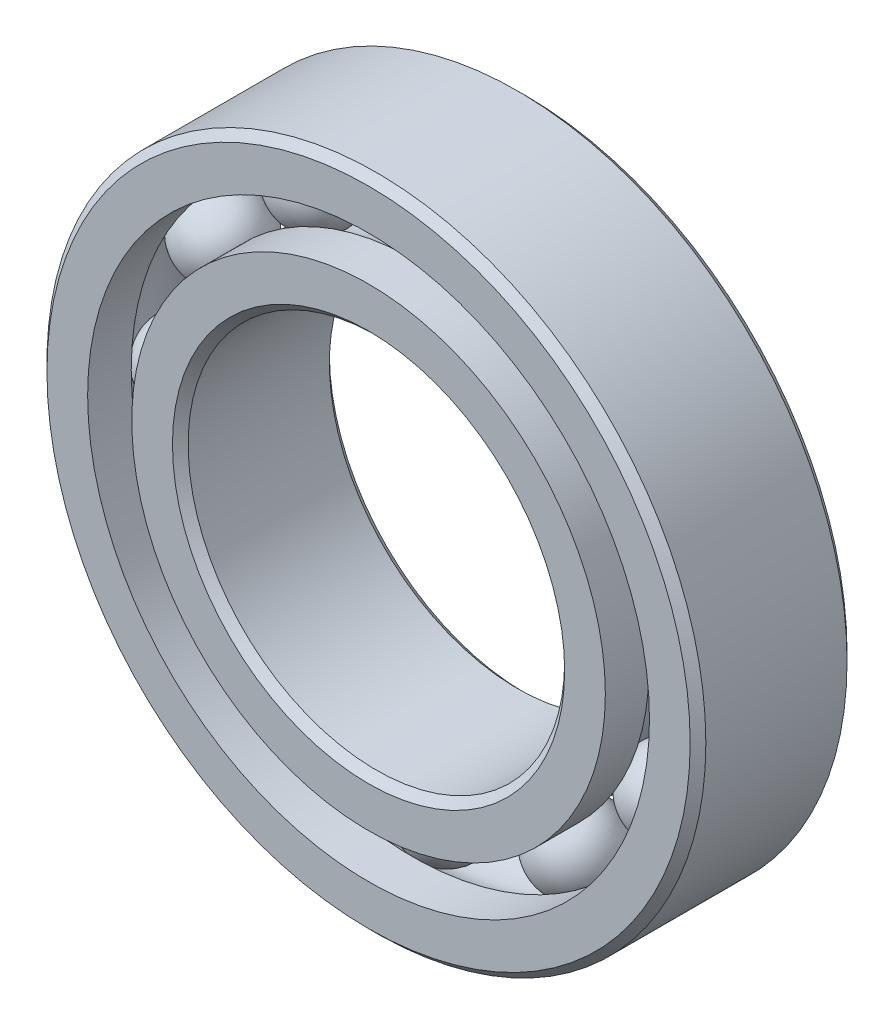
ISO-10303-21;
HEADER;
FILE_DESCRIPTION(('STEP AP214'),'2;1');
FILE_NAME('part.step','',(''),(''),'','','');
FILE_SCHEMA(('AUTOMOTIVE_DESIGN { 1 0 10303 214 1 1 1 1 }'));
ENDSEC;
DATA;
#1=APPLICATION_CONTEXT('core data for automotive mechanical design processes');
#2=APPLICATION_PROTOCOL_DEFINITION('international standard','automotive_design',2000,#1);
#3=PRODUCT_CONTEXT('',#1,'mechanical');
#4=PRODUCT('Part','Part','',(#3));
#5=PRODUCT_RELATED_PRODUCT_CATEGORY('part','',(#4));
#6=PRODUCT_DEFINITION_FORMATION('','',#4);
#7=PRODUCT_DEFINITION_CONTEXT('part definition',#1,'design');
#8=PRODUCT_DEFINITION('design','',#6,#7);
#9=PRODUCT_DEFINITION_SHAPE('','',#8);
#10=(LENGTH_UNIT() NAMED_UNIT(*) SI_UNIT(.MILLI.,.METRE.));
#11=(NAMED_UNIT(*) PLANE_ANGLE_UNIT() SI_UNIT($,.RADIAN.));
#12=(NAMED_UNIT(*) SI_UNIT($,.STERADIAN.) SOLID_ANGLE_UNIT());
#13=UNCERTAINTY_MEASURE_WITH_UNIT(LENGTH_MEASURE(1.E-05),#10,'distance_accuracy_value','');
#14=(GEOMETRIC_REPRESENTATION_CONTEXT(3) GLOBAL_UNCERTAINTY_ASSIGNED_CONTEXT((#13)) GLOBAL_UNIT_ASSIGNED_CONTEXT((#10,
#11,#12)) REPRESENTATION_CONTEXT('',''));
#15=CARTESIAN_POINT('',(0.,0.,0.));
#16=DIRECTION('',(0.,0.,1.));
#17=DIRECTION('',(1.,0.,0.));
#18=AXIS2_PLACEMENT_3D('',#15,#16,#17);
#19=CARTESIAN_POINT('',(-4.12499999999991,7.14470958122167,0.));
#20=DIRECTION('',(0.,0.,1.));
#21=DIRECTION('',(-0.499999999999989,0.866025403784445,0.));
#22=AXIS2_PLACEMENT_3D('',#19,#20,#21);
#23=SPHERICAL_SURFACE('',#22,1.31498827146959);
#24=CARTESIAN_POINT('',(-4.12499999999991,7.14470958122167,1.31498827146959));
#25=VERTEX_POINT('',#24);
#26=VERTEX_LOOP('',#25);
#27=FACE_BOUND('',#26,.T.);
#28=ADVANCED_FACE('F40',(#27),#23,.T.);
#29=CLOSED_SHELL('',(#28));
#30=MANIFOLD_SOLID_BREP('B2',#29);
#31=CARTESIAN_POINT('',(-7.14470958122157,4.12500000000008,0.));
#32=DIRECTION('',(0.,0.,1.));
#33=DIRECTION('',(-0.866025403784433,0.50000000000001,0.));
#34=AXIS2_PLACEMENT_3D('',#31,#32,#33);
#35=SPHERICAL_SURFACE('',#34,1.31498827146959);
#36=CARTESIAN_POINT('',(-7.14470958122157,4.12500000000008,1.31498827146959));
#37=VERTEX_POINT('',#36);
#38=VERTEX_LOOP('',#37);
#39=FACE_BOUND('',#38,.T.);
#40=ADVANCED_FACE('F61',(#39),#35,.T.);
#41=CLOSED_SHELL('',(#40));
#42=MANIFOLD_SOLID_BREP('B6',#41);
#43=CARTESIAN_POINT('',(-8.25,0.,0.));
#44=DIRECTION('',(0.,0.,1.));
#45=DIRECTION('',(-1.,0.,0.));
#46=AXIS2_PLACEMENT_3D('',#43,#44,#45);
#47=SPHERICAL_SURFACE('',#46,1.31498827146959);
#48=CARTESIAN_POINT('',(-8.25,0.,1.31498827146959));
#49=VERTEX_POINT('',#48);
#50=VERTEX_LOOP('',#49);
#51=FACE_BOUND('',#50,.T.);
#52=ADVANCED_FACE('F82',(#51),#47,.T.);
#53=CLOSED_SHELL('',(#52));
#54=MANIFOLD_SOLID_BREP('B36',#53);
#55=CARTESIAN_POINT('',(-7.14470958122166,-4.12499999999993,0.));
#56=DIRECTION('',(0.,0.,1.));
#57=DIRECTION('',(-0.866025403784443,-0.499999999999992,0.));
#58=AXIS2_PLACEMENT_3D('',#55,#56,#57);
#59=SPHERICAL_SURFACE('',#58,1.31498827146959);
#60=CARTESIAN_POINT('',(-7.14470958122166,-4.12499999999993,1.31498827146959));
#61=VERTEX_POINT('',#60);
#62=VERTEX_LOOP('',#61);
#63=FACE_BOUND('',#62,.T.);
#64=ADVANCED_FACE('F103',(#63),#59,.T.);
#65=CLOSED_SHELL('',(#64));
#66=MANIFOLD_SOLID_BREP('B57',#65);
#67=CARTESIAN_POINT('',(-4.12500000000006,-7.14470958122159,0.));
#68=DIRECTION('',(0.,0.,1.));
#69=DIRECTION('',(-0.500000000000007,-0.866025403784435,0.));
#70=AXIS2_PLACEMENT_3D('',#67,#68,#69);
#71=SPHERICAL_SURFACE('',#70,1.31498827146959);
#72=CARTESIAN_POINT('',(-4.12500000000006,-7.14470958122159,1.31498827146959));
#73=VERTEX_POINT('',#72);
#74=VERTEX_LOOP('',#73);
#75=FACE_BOUND('',#74,.T.);
#76=ADVANCED_FACE('F124',(#75),#71,.T.);
#77=CLOSED_SHELL('',(#76));
#78=MANIFOLD_SOLID_BREP('B78',#77);
#79=CARTESIAN_POINT('',(0.,-8.25,0.));
#80=DIRECTION('',(0.,0.,1.));
#81=DIRECTION('',(0.,-1.,0.));
#82=AXIS2_PLACEMENT_3D('',#79,#80,#81);
#83=SPHERICAL_SURFACE('',#82,1.31498827146959);
#84=CARTESIAN_POINT('',(0.,-8.25,1.31498827146959));
#85=VERTEX_POINT('',#84);
#86=VERTEX_LOOP('',#85);
#87=FACE_BOUND('',#86,.T.);
#88=ADVANCED_FACE('F145',(#87),#83,.T.);
#89=CLOSED_SHELL('',(#88));
#90=MANIFOLD_SOLID_BREP('B99',#89);
#91=CARTESIAN_POINT('',(4.12499999999996,-7.14470958122164,0.));
#92=DIRECTION('',(0.,0.,1.));
#93=DIRECTION('',(0.499999999999995,-0.866025403784442,0.));
#94=AXIS2_PLACEMENT_3D('',#91,#92,#93);
#95=SPHERICAL_SURFACE('',#94,1.31498827146959);
#96=CARTESIAN_POINT('',(4.12499999999996,-7.14470958122164,1.31498827146959));
#97=VERTEX_POINT('',#96);
#98=VERTEX_LOOP('',#97);
#99=FACE_BOUND('',#98,.T.);
#100=ADVANCED_FACE('F166',(#99),#95,.T.);
#101=CLOSED_SHELL('',(#100));
#102=MANIFOLD_SOLID_BREP('B120',#101);
#103=CARTESIAN_POINT('',(7.1447095812216,-4.12500000000003,0.));
#104=DIRECTION('',(0.,0.,1.));
#105=DIRECTION('',(0.866025403784436,-0.500000000000004,0.));
#106=AXIS2_PLACEMENT_3D('',#103,#104,#105);
#107=SPHERICAL_SURFACE('',#106,1.31498827146959);
#108=CARTESIAN_POINT('',(7.1447095812216,-4.12500000000003,1.31498827146959));
#109=VERTEX_POINT('',#108);
#110=VERTEX_LOOP('',#109);
#111=FACE_BOUND('',#110,.T.);
#112=ADVANCED_FACE('F187',(#111),#107,.T.);
#113=CLOSED_SHELL('',(#112));
#114=MANIFOLD_SOLID_BREP('B141',#113);
#115=CARTESIAN_POINT('',(8.25,0.,0.));
#116=DIRECTION('',(0.,0.,1.));
#117=DIRECTION('',(1.,0.,0.));
#118=AXIS2_PLACEMENT_3D('',#115,#116,#117);
#119=SPHERICAL_SURFACE('',#118,1.31498827146959);
#120=CARTESIAN_POINT('',(8.25,0.,1.31498827146959));
#121=VERTEX_POINT('',#120);
#122=VERTEX_LOOP('',#121);
#123=FACE_BOUND('',#122,.T.);
#124=ADVANCED_FACE('F208',(#123),#119,.T.);
#125=CLOSED_SHELL('',(#124));
#126=MANIFOLD_SOLID_BREP('B162',#125);
#127=CARTESIAN_POINT('',(7.14470958122163,4.12499999999998,0.));
#128=DIRECTION('',(0.,0.,1.));
#129=DIRECTION('',(0.86602540378444,0.499999999999998,0.));
#130=AXIS2_PLACEMENT_3D('',#127,#128,#129);
#131=SPHERICAL_SURFACE('',#130,1.31498827146959);
#132=CARTESIAN_POINT('',(7.14470958122163,4.12499999999998,1.31498827146959));
#133=VERTEX_POINT('',#132);
#134=VERTEX_LOOP('',#133);
#135=FACE_BOUND('',#134,.T.);
#136=ADVANCED_FACE('F229',(#135),#131,.T.);
#137=CLOSED_SHELL('',(#136));
#138=MANIFOLD_SOLID_BREP('B183',#137);
#139=CARTESIAN_POINT('',(4.12500000000001,7.14470958122161,0.));
#140=DIRECTION('',(0.,0.,1.));
#141=DIRECTION('',(0.500000000000001,0.866025403784438,0.));
#142=AXIS2_PLACEMENT_3D('',#139,#140,#141);
#143=SPHERICAL_SURFACE('',#142,1.31498827146959);
#144=CARTESIAN_POINT('',(4.12500000000001,7.14470958122161,1.31498827146959));
#145=VERTEX_POINT('',#144);
#146=VERTEX_LOOP('',#145);
#147=FACE_BOUND('',#146,.T.);
#148=ADVANCED_FACE('F250',(#147),#143,.T.);
#149=CLOSED_SHELL('',(#148));
#150=MANIFOLD_SOLID_BREP('B204',#149);
#151=CARTESIAN_POINT('',(0.,8.25,0.));
#152=DIRECTION('',(0.,0.,1.));
#153=DIRECTION('',(0.,1.,0.));
#154=AXIS2_PLACEMENT_3D('',#151,#152,#153);
#155=SPHERICAL_SURFACE('',#154,1.31498827146959);
#156=CARTESIAN_POINT('',(0.,8.25,1.31498827146959));
#157=VERTEX_POINT('',#156);
#158=VERTEX_LOOP('',#157);
#159=FACE_BOUND('',#158,.T.);
#160=ADVANCED_FACE('F273',(#159),#155,.T.);
#161=CLOSED_SHELL('',(#160));
#162=MANIFOLD_SOLID_BREP('B225',#161);
#163=CARTESIAN_POINT('',(0.,7.5467032967033,2.5));
#164=DIRECTION('',(0.,0.,-1.));
#165=DIRECTION('',(-1.,0.,0.));
#166=AXIS2_PLACEMENT_3D('',#163,#164,#165);
#167=PLANE('',#166);
#168=CARTESIAN_POINT('',(0.,0.,2.5));
#169=DIRECTION('',(0.,0.,1.));
#170=DIRECTION('',(1.,0.,0.));
#171=AXIS2_PLACEMENT_3D('',#168,#169,#170);
#172=CIRCLE('',#171,6.25);
#173=CARTESIAN_POINT('',(6.25,0.,2.5));
#174=VERTEX_POINT('',#173);
#175=EDGE_CURVE('E321',#174,#174,#172,.T.);
#176=ORIENTED_EDGE('',*,*,#175,.F.);
#177=EDGE_LOOP('',(#176));
#178=FACE_BOUND('',#177,.T.);
#179=CARTESIAN_POINT('',(0.,0.,2.5));
#180=DIRECTION('',(0.,0.,1.));
#181=DIRECTION('',(1.,0.,0.));
#182=AXIS2_PLACEMENT_3D('',#179,#180,#181);
#183=CIRCLE('',#182,7.5467032967033);
#184=CARTESIAN_POINT('',(7.5467032967033,0.,2.5));
#185=VERTEX_POINT('',#184);
#186=EDGE_CURVE('E272',#185,#185,#183,.T.);
#187=ORIENTED_EDGE('',*,*,#186,.T.);
#188=EDGE_LOOP('',(#187));
#189=FACE_BOUND('',#188,.T.);
#190=ADVANCED_FACE('F293',(#178,#189),#167,.F.);
#191=CARTESIAN_POINT('',(0.,0.,2.5));
#192=DIRECTION('',(0.,0.,1.));
#193=DIRECTION('',(1.,0.,0.));
#194=AXIS2_PLACEMENT_3D('',#191,#192,#193);
#195=CYLINDRICAL_SURFACE('',#194,7.5467032967033);
#196=ORIENTED_EDGE('',*,*,#186,.F.);
#197=EDGE_LOOP('',(#196));
#198=FACE_BOUND('',#197,.T.);
#199=CARTESIAN_POINT('',(0.,0.,1.11111111111111));
#200=DIRECTION('',(0.,0.,1.));
#201=DIRECTION('',(1.,0.,0.));
#202=AXIS2_PLACEMENT_3D('',#199,#200,#201);
#203=CIRCLE('',#202,7.5467032967033);
#204=CARTESIAN_POINT('',(7.5467032967033,0.,1.11111111111111));
#205=VERTEX_POINT('',#204);
#206=EDGE_CURVE('E299',#205,#205,#203,.T.);
#207=ORIENTED_EDGE('',*,*,#206,.T.);
#208=EDGE_LOOP('',(#207));
#209=FACE_BOUND('',#208,.T.);
#210=ADVANCED_FACE('F328',(#198,#209),#195,.T.);
#211=CARTESIAN_POINT('',(0.,0.,0.));
#212=DIRECTION('',(0.,0.,1.));
#213=DIRECTION('',(1.,0.,0.));
#214=AXIS2_PLACEMENT_3D('',#211,#212,#213);
#215=TOROIDAL_SURFACE('',#214,8.25,1.31498827146959);
#216=ORIENTED_EDGE('',*,*,#206,.F.);
#217=EDGE_LOOP('',(#216));
#218=FACE_BOUND('',#217,.T.);
#219=CARTESIAN_POINT('',(0.,0.,-1.11111111111111));
#220=DIRECTION('',(0.,0.,1.));
#221=DIRECTION('',(1.,0.,0.));
#222=AXIS2_PLACEMENT_3D('',#219,#220,#221);
#223=CIRCLE('',#222,7.5467032967033);
#224=CARTESIAN_POINT('',(7.5467032967033,0.,-1.11111111111111));
#225=VERTEX_POINT('',#224);
#226=EDGE_CURVE('E303',#225,#225,#223,.T.);
#227=ORIENTED_EDGE('',*,*,#226,.T.);
#228=EDGE_LOOP('',(#227));
#229=FACE_BOUND('',#228,.T.);
#230=ADVANCED_FACE('F332',(#218,#229),#215,.F.);
#231=CARTESIAN_POINT('',(0.,0.,2.5));
#232=DIRECTION('',(0.,0.,1.));
#233=DIRECTION('',(1.,0.,0.));
#234=AXIS2_PLACEMENT_3D('',#231,#232,#233);
#235=CYLINDRICAL_SURFACE('',#234,7.5467032967033);
#236=ORIENTED_EDGE('',*,*,#226,.F.);
#237=EDGE_LOOP('',(#236));
#238=FACE_BOUND('',#237,.T.);
#239=CARTESIAN_POINT('',(0.,0.,-2.5));
#240=DIRECTION('',(0.,0.,1.));
#241=DIRECTION('',(1.,0.,0.));
#242=AXIS2_PLACEMENT_3D('',#239,#240,#241);
#243=CIRCLE('',#242,7.5467032967033);
#244=CARTESIAN_POINT('',(7.5467032967033,0.,-2.5));
#245=VERTEX_POINT('',#244);
#246=EDGE_CURVE('E307',#245,#245,#243,.T.);
#247=ORIENTED_EDGE('',*,*,#246,.T.);
#248=EDGE_LOOP('',(#247));
#249=FACE_BOUND('',#248,.T.);
#250=ADVANCED_FACE('F337',(#238,#249),#235,.T.);
#251=CARTESIAN_POINT('',(0.,6.25,-2.5));
#252=DIRECTION('',(0.,0.,1.));
#253=DIRECTION('',(1.,0.,0.));
#254=AXIS2_PLACEMENT_3D('',#251,#252,#253);
#255=PLANE('',#254);
#256=ORIENTED_EDGE('',*,*,#246,.F.);
#257=EDGE_LOOP('',(#256));
#258=FACE_BOUND('',#257,.T.);
#259=CARTESIAN_POINT('',(0.,0.,-2.5));
#260=DIRECTION('',(0.,0.,1.));
#261=DIRECTION('',(1.,0.,0.));
#262=AXIS2_PLACEMENT_3D('',#259,#260,#261);
#263=CIRCLE('',#262,6.25);
#264=CARTESIAN_POINT('',(6.25,0.,-2.5));
#265=VERTEX_POINT('',#264);
#266=EDGE_CURVE('E312',#265,#265,#263,.T.);
#267=ORIENTED_EDGE('',*,*,#266,.T.);
#268=EDGE_LOOP('',(#267));
#269=FACE_BOUND('',#268,.T.);
#270=ADVANCED_FACE('F343',(#258,#269),#255,.F.);
#271=CARTESIAN_POINT('',(0.,0.,-2.25));
#272=DIRECTION('',(0.,0.,-1.));
#273=DIRECTION('',(-1.,0.,0.));
#274=AXIS2_PLACEMENT_3D('',#271,#272,#273);
#275=CONICAL_SURFACE('',#274,6.,0.785398163397445);
#276=ORIENTED_EDGE('',*,*,#266,.F.);
#277=EDGE_LOOP('',(#276));
#278=FACE_BOUND('',#277,.T.);
#279=CARTESIAN_POINT('',(0.,0.,-2.25));
#280=DIRECTION('',(0.,0.,1.));
#281=DIRECTION('',(1.,0.,0.));
#282=AXIS2_PLACEMENT_3D('',#279,#280,#281);
#283=CIRCLE('',#282,6.);
#284=CARTESIAN_POINT('',(6.,0.,-2.25));
#285=VERTEX_POINT('',#284);
#286=EDGE_CURVE('E315',#285,#285,#283,.T.);
#287=ORIENTED_EDGE('',*,*,#286,.T.);
#288=EDGE_LOOP('',(#287));
#289=FACE_BOUND('',#288,.T.);
#290=ADVANCED_FACE('F347',(#278,#289),#275,.F.);
#291=CARTESIAN_POINT('',(0.,0.,2.5));
#292=DIRECTION('',(0.,0.,1.));
#293=DIRECTION('',(1.,0.,0.));
#294=AXIS2_PLACEMENT_3D('',#291,#292,#293);
#295=CYLINDRICAL_SURFACE('',#294,6.);
#296=ORIENTED_EDGE('',*,*,#286,.F.);
#297=EDGE_LOOP('',(#296));
#298=FACE_BOUND('',#297,.T.);
#299=CARTESIAN_POINT('',(0.,0.,2.25));
#300=DIRECTION('',(0.,0.,1.));
#301=DIRECTION('',(1.,0.,0.));
#302=AXIS2_PLACEMENT_3D('',#299,#300,#301);
#303=CIRCLE('',#302,6.);
#304=CARTESIAN_POINT('',(6.,0.,2.25));
#305=VERTEX_POINT('',#304);
#306=EDGE_CURVE('E318',#305,#305,#303,.T.);
#307=ORIENTED_EDGE('',*,*,#306,.T.);
#308=EDGE_LOOP('',(#307));
#309=FACE_BOUND('',#308,.T.);
#310=ADVANCED_FACE('F351',(#298,#309),#295,.F.);
#311=CARTESIAN_POINT('',(0.,0.,2.5));
#312=DIRECTION('',(0.,0.,1.));
#313=DIRECTION('',(1.,0.,0.));
#314=AXIS2_PLACEMENT_3D('',#311,#312,#313);
#315=CONICAL_SURFACE('',#314,6.25,0.785398163397451);
#316=ORIENTED_EDGE('',*,*,#306,.F.);
#317=EDGE_LOOP('',(#316));
#318=FACE_BOUND('',#317,.T.);
#319=ORIENTED_EDGE('',*,*,#175,.T.);
#320=EDGE_LOOP('',(#319));
#321=FACE_BOUND('',#320,.T.);
#322=ADVANCED_FACE('F325',(#318,#321),#315,.F.);
#323=CLOSED_SHELL('',(#190,#210,#230,#250,#270,#290,#310,#322));
#324=MANIFOLD_SOLID_BREP('B246',#323);
#325=CARTESIAN_POINT('',(0.,0.,2.25));
#326=DIRECTION('',(0.,0.,-1.));
#327=DIRECTION('',(-1.,0.,0.));
#328=AXIS2_PLACEMENT_3D('',#325,#326,#327);
#329=CONICAL_SURFACE('',#328,10.5,0.785398163397446);
#330=CARTESIAN_POINT('',(0.,0.,2.5));
#331=DIRECTION('',(0.,0.,1.));
#332=DIRECTION('',(1.,0.,0.));
#333=AXIS2_PLACEMENT_3D('',#330,#331,#332);
#334=CIRCLE('',#333,10.25);
#335=CARTESIAN_POINT('',(10.25,0.,2.5));
#336=VERTEX_POINT('',#335);
#337=EDGE_CURVE('E443',#336,#336,#334,.T.);
#338=ORIENTED_EDGE('',*,*,#337,.F.);
#339=EDGE_LOOP('',(#338));
#340=FACE_BOUND('',#339,.T.);
#341=CARTESIAN_POINT('',(0.,0.,2.25));
#342=DIRECTION('',(0.,0.,1.));
#343=DIRECTION('',(1.,0.,0.));
#344=AXIS2_PLACEMENT_3D('',#341,#342,#343);
#345=CIRCLE('',#344,10.5);
#346=CARTESIAN_POINT('',(10.5,0.,2.25));
#347=VERTEX_POINT('',#346);
#348=EDGE_CURVE('E292',#347,#347,#345,.T.);
#349=ORIENTED_EDGE('',*,*,#348,.T.);
#350=EDGE_LOOP('',(#349));
#351=FACE_BOUND('',#350,.T.);
#352=ADVANCED_FACE('F415',(#340,#351),#329,.T.);
#353=CARTESIAN_POINT('',(0.,0.,2.5));
#354=DIRECTION('',(0.,0.,1.));
#355=DIRECTION('',(1.,0.,0.));
#356=AXIS2_PLACEMENT_3D('',#353,#354,#355);
#357=CYLINDRICAL_SURFACE('',#356,10.5);
#358=ORIENTED_EDGE('',*,*,#348,.F.);
#359=EDGE_LOOP('',(#358));
#360=FACE_BOUND('',#359,.T.);
#361=CARTESIAN_POINT('',(0.,0.,-2.25));
#362=DIRECTION('',(0.,0.,1.));
#363=DIRECTION('',(1.,0.,0.));
#364=AXIS2_PLACEMENT_3D('',#361,#362,#363);
#365=CIRCLE('',#364,10.5);
#366=CARTESIAN_POINT('',(10.5,0.,-2.25));
#367=VERTEX_POINT('',#366);
#368=EDGE_CURVE('E421',#367,#367,#365,.T.);
#369=ORIENTED_EDGE('',*,*,#368,.T.);
#370=EDGE_LOOP('',(#369));
#371=FACE_BOUND('',#370,.T.);
#372=ADVANCED_FACE('F450',(#360,#371),#357,.T.);
#373=CARTESIAN_POINT('',(0.,0.,-2.5));
#374=DIRECTION('',(0.,0.,1.));
#375=DIRECTION('',(1.,0.,0.));
#376=AXIS2_PLACEMENT_3D('',#373,#374,#375);
#377=CONICAL_SURFACE('',#376,10.25,0.785398163397445);
#378=ORIENTED_EDGE('',*,*,#368,.F.);
#379=EDGE_LOOP('',(#378));
#380=FACE_BOUND('',#379,.T.);
#381=CARTESIAN_POINT('',(0.,0.,-2.5));
#382=DIRECTION('',(0.,0.,1.));
#383=DIRECTION('',(1.,0.,0.));
#384=AXIS2_PLACEMENT_3D('',#381,#382,#383);
#385=CIRCLE('',#384,10.25);
#386=CARTESIAN_POINT('',(10.25,0.,-2.5));
#387=VERTEX_POINT('',#386);
#388=EDGE_CURVE('E425',#387,#387,#385,.T.);
#389=ORIENTED_EDGE('',*,*,#388,.T.);
#390=EDGE_LOOP('',(#389));
#391=FACE_BOUND('',#390,.T.);
#392=ADVANCED_FACE('F454',(#380,#391),#377,.T.);
#393=CARTESIAN_POINT('',(0.,10.25,-2.5));
#394=DIRECTION('',(0.,0.,1.));
#395=DIRECTION('',(1.,0.,0.));
#396=AXIS2_PLACEMENT_3D('',#393,#394,#395);
#397=PLANE('',#396);
#398=ORIENTED_EDGE('',*,*,#388,.F.);
#399=EDGE_LOOP('',(#398));
#400=FACE_BOUND('',#399,.T.);
#401=CARTESIAN_POINT('',(0.,0.,-2.5));
#402=DIRECTION('',(0.,0.,1.));
#403=DIRECTION('',(1.,0.,0.));
#404=AXIS2_PLACEMENT_3D('',#401,#402,#403);
#405=CIRCLE('',#404,8.9532967032967);
#406=CARTESIAN_POINT('',(8.9532967032967,0.,-2.5));
#407=VERTEX_POINT('',#406);
#408=EDGE_CURVE('E429',#407,#407,#405,.T.);
#409=ORIENTED_EDGE('',*,*,#408,.T.);
#410=EDGE_LOOP('',(#409));
#411=FACE_BOUND('',#410,.T.);
#412=ADVANCED_FACE('F459',(#400,#411),#397,.F.);
#413=CARTESIAN_POINT('',(0.,0.,2.5));
#414=DIRECTION('',(0.,0.,1.));
#415=DIRECTION('',(1.,0.,0.));
#416=AXIS2_PLACEMENT_3D('',#413,#414,#415);
#417=CYLINDRICAL_SURFACE('',#416,8.9532967032967);
#418=ORIENTED_EDGE('',*,*,#408,.F.);
#419=EDGE_LOOP('',(#418));
#420=FACE_BOUND('',#419,.T.);
#421=CARTESIAN_POINT('',(0.,0.,-1.11111111111111));
#422=DIRECTION('',(0.,0.,1.));
#423=DIRECTION('',(1.,0.,0.));
#424=AXIS2_PLACEMENT_3D('',#421,#422,#423);
#425=CIRCLE('',#424,8.9532967032967);
#426=CARTESIAN_POINT('',(8.9532967032967,0.,-1.11111111111111));
#427=VERTEX_POINT('',#426);
#428=EDGE_CURVE('E434',#427,#427,#425,.T.);
#429=ORIENTED_EDGE('',*,*,#428,.T.);
#430=EDGE_LOOP('',(#429));
#431=FACE_BOUND('',#430,.T.);
#432=ADVANCED_FACE('F465',(#420,#431),#417,.F.);
#433=CARTESIAN_POINT('',(0.,0.,0.));
#434=DIRECTION('',(0.,0.,1.));
#435=DIRECTION('',(1.,0.,0.));
#436=AXIS2_PLACEMENT_3D('',#433,#434,#435);
#437=TOROIDAL_SURFACE('',#436,8.25,1.31498827146959);
#438=ORIENTED_EDGE('',*,*,#428,.F.);
#439=EDGE_LOOP('',(#438));
#440=FACE_BOUND('',#439,.T.);
#441=CARTESIAN_POINT('',(0.,0.,1.11111111111111));
#442=DIRECTION('',(0.,0.,1.));
#443=DIRECTION('',(1.,0.,0.));
#444=AXIS2_PLACEMENT_3D('',#441,#442,#443);
#445=CIRCLE('',#444,8.9532967032967);
#446=CARTESIAN_POINT('',(8.9532967032967,0.,1.11111111111111));
#447=VERTEX_POINT('',#446);
#448=EDGE_CURVE('E437',#447,#447,#445,.T.);
#449=ORIENTED_EDGE('',*,*,#448,.T.);
#450=EDGE_LOOP('',(#449));
#451=FACE_BOUND('',#450,.T.);
#452=ADVANCED_FACE('F469',(#440,#451),#437,.F.);
#453=CARTESIAN_POINT('',(0.,0.,2.5));
#454=DIRECTION('',(0.,0.,1.));
#455=DIRECTION('',(1.,0.,0.));
#456=AXIS2_PLACEMENT_3D('',#453,#454,#455);
#457=CYLINDRICAL_SURFACE('',#456,8.9532967032967);
#458=ORIENTED_EDGE('',*,*,#448,.F.);
#459=EDGE_LOOP('',(#458));
#460=FACE_BOUND('',#459,.T.);
#461=CARTESIAN_POINT('',(0.,0.,2.5));
#462=DIRECTION('',(0.,0.,1.));
#463=DIRECTION('',(1.,0.,0.));
#464=AXIS2_PLACEMENT_3D('',#461,#462,#463);
#465=CIRCLE('',#464,8.9532967032967);
#466=CARTESIAN_POINT('',(8.9532967032967,0.,2.5));
#467=VERTEX_POINT('',#466);
#468=EDGE_CURVE('E440',#467,#467,#465,.T.);
#469=ORIENTED_EDGE('',*,*,#468,.T.);
#470=EDGE_LOOP('',(#469));
#471=FACE_BOUND('',#470,.T.);
#472=ADVANCED_FACE('F473',(#460,#471),#457,.F.);
#473=CARTESIAN_POINT('',(0.,10.25,2.5));
#474=DIRECTION('',(0.,0.,-1.));
#475=DIRECTION('',(-1.,0.,0.));
#476=AXIS2_PLACEMENT_3D('',#473,#474,#475);
#477=PLANE('',#476);
#478=ORIENTED_EDGE('',*,*,#468,.F.);
#479=EDGE_LOOP('',(#478));
#480=FACE_BOUND('',#479,.T.);
#481=ORIENTED_EDGE('',*,*,#337,.T.);
#482=EDGE_LOOP('',(#481));
#483=FACE_BOUND('',#482,.T.);
#484=ADVANCED_FACE('F447',(#480,#483),#477,.F.);
#485=CLOSED_SHELL('',(#352,#372,#392,#412,#432,#452,#472,#484));
#486=MANIFOLD_SOLID_BREP('B267',#485);
#487=ADVANCED_BREP_SHAPE_REPRESENTATION('',(#18,#30,#42,#54,#66,#78,#90,#102,#114,#126,#138,
#150,#162,#324,#486),#14);
#488=SHAPE_DEFINITION_REPRESENTATION(#9,#487);
ENDSEC;
END-ISO-10303-21;
